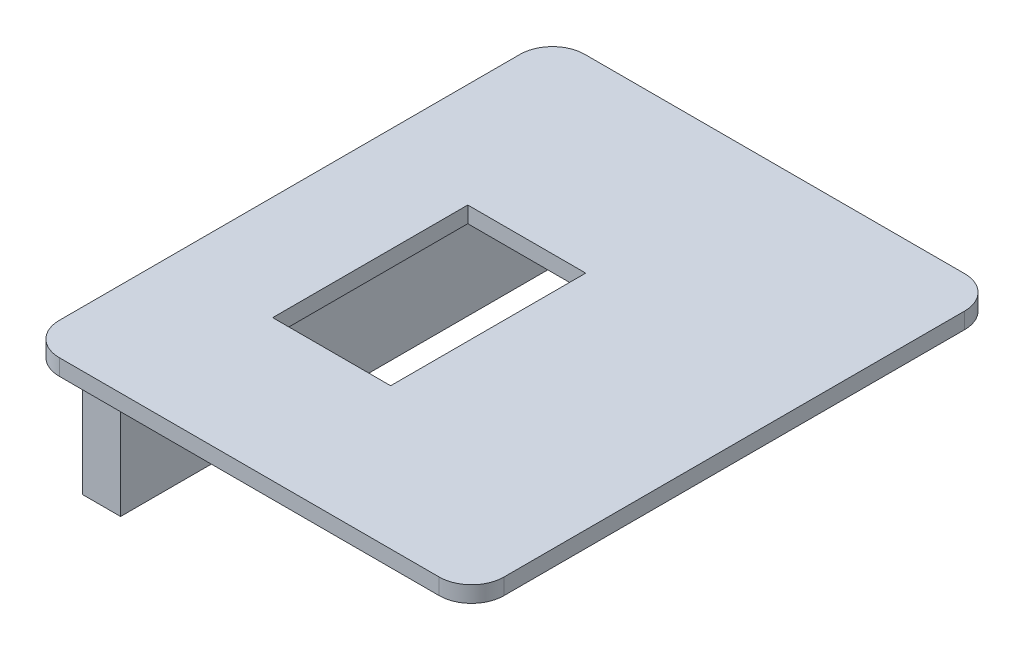
ISO-10303-21;
HEADER;
FILE_DESCRIPTION(('STEP AP214'),'2;1');
FILE_NAME('part.step','',(''),(''),'','','');
FILE_SCHEMA(('AUTOMOTIVE_DESIGN { 1 0 10303 214 1 1 1 1 }'));
ENDSEC;
DATA;
#1=APPLICATION_CONTEXT('core data for automotive mechanical design processes');
#2=APPLICATION_PROTOCOL_DEFINITION('international standard','automotive_design',2000,#1);
#3=PRODUCT_CONTEXT('',#1,'mechanical');
#4=PRODUCT('Part','Part','',(#3));
#5=PRODUCT_RELATED_PRODUCT_CATEGORY('part','',(#4));
#6=PRODUCT_DEFINITION_FORMATION('','',#4);
#7=PRODUCT_DEFINITION_CONTEXT('part definition',#1,'design');
#8=PRODUCT_DEFINITION('design','',#6,#7);
#9=PRODUCT_DEFINITION_SHAPE('','',#8);
#10=(LENGTH_UNIT() NAMED_UNIT(*) SI_UNIT(.MILLI.,.METRE.));
#11=(NAMED_UNIT(*) PLANE_ANGLE_UNIT() SI_UNIT($,.RADIAN.));
#12=(NAMED_UNIT(*) SI_UNIT($,.STERADIAN.) SOLID_ANGLE_UNIT());
#13=UNCERTAINTY_MEASURE_WITH_UNIT(LENGTH_MEASURE(1.E-05),#10,'distance_accuracy_value','');
#14=(GEOMETRIC_REPRESENTATION_CONTEXT(3) GLOBAL_UNCERTAINTY_ASSIGNED_CONTEXT((#13)) GLOBAL_UNIT_ASSIGNED_CONTEXT((#10,
#11,#12)) REPRESENTATION_CONTEXT('',''));
#15=CARTESIAN_POINT('',(0.,0.,0.));
#16=DIRECTION('',(0.,0.,1.));
#17=DIRECTION('',(1.,0.,0.));
#18=AXIS2_PLACEMENT_3D('',#15,#16,#17);
#19=CARTESIAN_POINT('',(23.5,0.,28.5));
#20=DIRECTION('',(0.,1.,0.));
#21=DIRECTION('',(0.,0.,1.));
#22=AXIS2_PLACEMENT_3D('',#19,#20,#21);
#23=PLANE('',#22);
#24=DIRECTION('',(0.,0.,-1.));
#25=VECTOR('',#24,1.);
#26=CARTESIAN_POINT('',(0.,0.,-9.11989795918369));
#27=LINE('',#26,#25);
#28=CARTESIAN_POINT('',(0.,0.,15.0127551020408));
#29=VERTEX_POINT('',#28);
#30=CARTESIAN_POINT('',(0.,0.,-9.11989795918369));
#31=VERTEX_POINT('',#30);
#32=EDGE_CURVE('E169',#29,#31,#27,.T.);
#33=ORIENTED_EDGE('',*,*,#32,.T.);
#34=DIRECTION('',(-1.,0.,0.));
#35=VECTOR('',#34,1.);
#36=CARTESIAN_POINT('',(-14.5918367346939,0.,-9.11989795918369));
#37=LINE('',#36,#35);
#38=CARTESIAN_POINT('',(-14.5918367346939,0.,-9.11989795918369));
#39=VERTEX_POINT('',#38);
#40=EDGE_CURVE('E172',#31,#39,#37,.T.);
#41=ORIENTED_EDGE('',*,*,#40,.T.);
#42=DIRECTION('',(0.,0.,1.));
#43=VECTOR('',#42,1.);
#44=CARTESIAN_POINT('',(-14.5918367346939,0.,-9.11989795918369));
#45=LINE('',#44,#43);
#46=CARTESIAN_POINT('',(-14.5918367346939,0.,15.0127551020408));
#47=VERTEX_POINT('',#46);
#48=EDGE_CURVE('E191',#39,#47,#45,.T.);
#49=ORIENTED_EDGE('',*,*,#48,.T.);
#50=DIRECTION('',(1.,0.,0.));
#51=VECTOR('',#50,1.);
#52=CARTESIAN_POINT('',(-14.5918367346939,0.,15.0127551020408));
#53=LINE('',#52,#51);
#54=EDGE_CURVE('E181',#47,#29,#53,.T.);
#55=ORIENTED_EDGE('',*,*,#54,.T.);
#56=EDGE_LOOP('',(#33,#41,#49,#55));
#57=FACE_BOUND('',#56,.T.);
#58=CARTESIAN_POINT('',(23.5,0.,28.5));
#59=DIRECTION('',(0.,1.,0.));
#60=DIRECTION('',(0.,0.,1.));
#61=AXIS2_PLACEMENT_3D('',#58,#59,#60);
#62=CIRCLE('',#61,4.);
#63=CARTESIAN_POINT('',(23.5,0.,32.5));
#64=VERTEX_POINT('',#63);
#65=CARTESIAN_POINT('',(27.5,0.,28.5));
#66=VERTEX_POINT('',#65);
#67=EDGE_CURVE('E205',#64,#66,#62,.T.);
#68=ORIENTED_EDGE('',*,*,#67,.F.);
#69=DIRECTION('',(1.,0.,0.));
#70=VECTOR('',#69,1.);
#71=CARTESIAN_POINT('',(-23.5,0.,32.5));
#72=LINE('',#71,#70);
#73=CARTESIAN_POINT('',(-23.5,0.,32.5));
#74=VERTEX_POINT('',#73);
#75=EDGE_CURVE('E210',#74,#64,#72,.T.);
#76=ORIENTED_EDGE('',*,*,#75,.F.);
#77=CARTESIAN_POINT('',(-23.5,0.,28.5));
#78=DIRECTION('',(0.,1.,0.));
#79=DIRECTION('',(0.,0.,-1.));
#80=AXIS2_PLACEMENT_3D('',#77,#78,#79);
#81=CIRCLE('',#80,4.);
#82=CARTESIAN_POINT('',(-27.5,0.,28.5));
#83=VERTEX_POINT('',#82);
#84=EDGE_CURVE('E237',#83,#74,#81,.T.);
#85=ORIENTED_EDGE('',*,*,#84,.F.);
#86=DIRECTION('',(0.,0.,1.));
#87=VECTOR('',#86,1.);
#88=CARTESIAN_POINT('',(-27.5,0.,28.5));
#89=LINE('',#88,#87);
#90=CARTESIAN_POINT('',(-27.5,0.,-28.5));
#91=VERTEX_POINT('',#90);
#92=EDGE_CURVE('E235',#91,#83,#89,.T.);
#93=ORIENTED_EDGE('',*,*,#92,.F.);
#94=CARTESIAN_POINT('',(-23.5,0.,-28.5));
#95=DIRECTION('',(0.,1.,0.));
#96=DIRECTION('',(0.,0.,-1.));
#97=AXIS2_PLACEMENT_3D('',#94,#95,#96);
#98=CIRCLE('',#97,4.);
#99=CARTESIAN_POINT('',(-23.5,0.,-32.5));
#100=VERTEX_POINT('',#99);
#101=EDGE_CURVE('E233',#100,#91,#98,.T.);
#102=ORIENTED_EDGE('',*,*,#101,.F.);
#103=DIRECTION('',(-1.,0.,0.));
#104=VECTOR('',#103,1.);
#105=CARTESIAN_POINT('',(-23.5,0.,-32.5));
#106=LINE('',#105,#104);
#107=CARTESIAN_POINT('',(23.5,0.,-32.5));
#108=VERTEX_POINT('',#107);
#109=EDGE_CURVE('E231',#108,#100,#106,.T.);
#110=ORIENTED_EDGE('',*,*,#109,.F.);
#111=CARTESIAN_POINT('',(23.5,0.,-28.5));
#112=DIRECTION('',(0.,1.,0.));
#113=DIRECTION('',(0.,0.,-1.));
#114=AXIS2_PLACEMENT_3D('',#111,#112,#113);
#115=CIRCLE('',#114,4.);
#116=CARTESIAN_POINT('',(27.5,0.,-28.5));
#117=VERTEX_POINT('',#116);
#118=EDGE_CURVE('E229',#117,#108,#115,.T.);
#119=ORIENTED_EDGE('',*,*,#118,.F.);
#120=DIRECTION('',(0.,0.,-1.));
#121=VECTOR('',#120,1.);
#122=CARTESIAN_POINT('',(27.5,0.,28.5));
#123=LINE('',#122,#121);
#124=EDGE_CURVE('E227',#66,#117,#123,.T.);
#125=ORIENTED_EDGE('',*,*,#124,.F.);
#126=EDGE_LOOP('',(#68,#76,#85,#93,#102,#110,#119,#125));
#127=FACE_BOUND('',#126,.T.);
#128=DIRECTION('',(0.,0.,1.));
#129=VECTOR('',#128,1.);
#130=CARTESIAN_POINT('',(-21.1919149970353,0.,27.2281366867646));
#131=LINE('',#130,#129);
#132=CARTESIAN_POINT('',(-21.1919149970353,0.,-27.2281366867647));
#133=VERTEX_POINT('',#132);
#134=CARTESIAN_POINT('',(-21.1919149970353,0.,27.2281366867646));
#135=VERTEX_POINT('',#134);
#136=EDGE_CURVE('E168',#133,#135,#131,.T.);
#137=ORIENTED_EDGE('',*,*,#136,.F.);
#138=DIRECTION('',(1.,0.,0.));
#139=VECTOR('',#138,1.);
#140=CARTESIAN_POINT('',(-25.8819289717891,0.,-27.2281366867647));
#141=LINE('',#140,#139);
#142=CARTESIAN_POINT('',(-25.8819289717891,0.,-27.2281366867647));
#143=VERTEX_POINT('',#142);
#144=EDGE_CURVE('E165',#143,#133,#141,.T.);
#145=ORIENTED_EDGE('',*,*,#144,.F.);
#146=DIRECTION('',(0.,0.,-1.));
#147=VECTOR('',#146,1.);
#148=CARTESIAN_POINT('',(-25.8819289717891,0.,27.2281366867646));
#149=LINE('',#148,#147);
#150=CARTESIAN_POINT('',(-25.8819289717891,0.,27.2281366867646));
#151=VERTEX_POINT('',#150);
#152=EDGE_CURVE('E55',#151,#143,#149,.T.);
#153=ORIENTED_EDGE('',*,*,#152,.F.);
#154=DIRECTION('',(-1.,0.,0.));
#155=VECTOR('',#154,1.);
#156=CARTESIAN_POINT('',(-25.8819289717891,0.,27.2281366867646));
#157=LINE('',#156,#155);
#158=EDGE_CURVE('E50',#135,#151,#157,.T.);
#159=ORIENTED_EDGE('',*,*,#158,.F.);
#160=EDGE_LOOP('',(#137,#145,#153,#159));
#161=FACE_BOUND('',#160,.T.);
#162=ADVANCED_FACE('F35',(#57,#127,#161),#23,.F.);
#163=CARTESIAN_POINT('',(23.5,2.,28.5));
#164=DIRECTION('',(0.,1.,0.));
#165=DIRECTION('',(0.,0.,1.));
#166=AXIS2_PLACEMENT_3D('',#163,#164,#165);
#167=PLANE('',#166);
#168=CARTESIAN_POINT('',(23.5,2.,28.5));
#169=DIRECTION('',(0.,1.,0.));
#170=DIRECTION('',(0.,0.,1.));
#171=AXIS2_PLACEMENT_3D('',#168,#169,#170);
#172=CIRCLE('',#171,4.);
#173=CARTESIAN_POINT('',(23.5,2.,32.5));
#174=VERTEX_POINT('',#173);
#175=CARTESIAN_POINT('',(27.5,2.,28.5));
#176=VERTEX_POINT('',#175);
#177=EDGE_CURVE('E206',#174,#176,#172,.T.);
#178=ORIENTED_EDGE('',*,*,#177,.T.);
#179=DIRECTION('',(0.,0.,-1.));
#180=VECTOR('',#179,1.);
#181=CARTESIAN_POINT('',(27.5,2.,28.5));
#182=LINE('',#181,#180);
#183=CARTESIAN_POINT('',(27.5,2.,-28.5));
#184=VERTEX_POINT('',#183);
#185=EDGE_CURVE('E209',#176,#184,#182,.T.);
#186=ORIENTED_EDGE('',*,*,#185,.T.);
#187=CARTESIAN_POINT('',(23.5,2.,-28.5));
#188=DIRECTION('',(0.,1.,0.));
#189=DIRECTION('',(0.,0.,-1.));
#190=AXIS2_PLACEMENT_3D('',#187,#188,#189);
#191=CIRCLE('',#190,4.);
#192=CARTESIAN_POINT('',(23.5,2.,-32.5));
#193=VERTEX_POINT('',#192);
#194=EDGE_CURVE('E212',#184,#193,#191,.T.);
#195=ORIENTED_EDGE('',*,*,#194,.T.);
#196=DIRECTION('',(-1.,0.,0.));
#197=VECTOR('',#196,1.);
#198=CARTESIAN_POINT('',(-23.5,2.,-32.5));
#199=LINE('',#198,#197);
#200=CARTESIAN_POINT('',(-23.5,2.,-32.5));
#201=VERTEX_POINT('',#200);
#202=EDGE_CURVE('E214',#193,#201,#199,.T.);
#203=ORIENTED_EDGE('',*,*,#202,.T.);
#204=CARTESIAN_POINT('',(-23.5,2.,-28.5));
#205=DIRECTION('',(0.,1.,0.));
#206=DIRECTION('',(0.,0.,-1.));
#207=AXIS2_PLACEMENT_3D('',#204,#205,#206);
#208=CIRCLE('',#207,4.);
#209=CARTESIAN_POINT('',(-27.5,2.,-28.5));
#210=VERTEX_POINT('',#209);
#211=EDGE_CURVE('E216',#201,#210,#208,.T.);
#212=ORIENTED_EDGE('',*,*,#211,.T.);
#213=DIRECTION('',(0.,0.,1.));
#214=VECTOR('',#213,1.);
#215=CARTESIAN_POINT('',(-27.5,2.,28.5));
#216=LINE('',#215,#214);
#217=CARTESIAN_POINT('',(-27.5,2.,28.5));
#218=VERTEX_POINT('',#217);
#219=EDGE_CURVE('E218',#210,#218,#216,.T.);
#220=ORIENTED_EDGE('',*,*,#219,.T.);
#221=CARTESIAN_POINT('',(-23.5,2.,28.5));
#222=DIRECTION('',(0.,1.,0.));
#223=DIRECTION('',(0.,0.,-1.));
#224=AXIS2_PLACEMENT_3D('',#221,#222,#223);
#225=CIRCLE('',#224,4.);
#226=CARTESIAN_POINT('',(-23.5,2.,32.5));
#227=VERTEX_POINT('',#226);
#228=EDGE_CURVE('E220',#218,#227,#225,.T.);
#229=ORIENTED_EDGE('',*,*,#228,.T.);
#230=DIRECTION('',(1.,0.,0.));
#231=VECTOR('',#230,1.);
#232=CARTESIAN_POINT('',(-23.5,2.,32.5));
#233=LINE('',#232,#231);
#234=EDGE_CURVE('E222',#227,#174,#233,.T.);
#235=ORIENTED_EDGE('',*,*,#234,.T.);
#236=EDGE_LOOP('',(#178,#186,#195,#203,#212,#220,#229,#235));
#237=FACE_BOUND('',#236,.T.);
#238=DIRECTION('',(-1.,0.,0.));
#239=VECTOR('',#238,1.);
#240=CARTESIAN_POINT('',(-14.5918367346939,2.,-9.11989795918369));
#241=LINE('',#240,#239);
#242=CARTESIAN_POINT('',(0.,2.,-9.11989795918369));
#243=VERTEX_POINT('',#242);
#244=CARTESIAN_POINT('',(-14.5918367346939,2.,-9.11989795918369));
#245=VERTEX_POINT('',#244);
#246=EDGE_CURVE('E180',#243,#245,#241,.T.);
#247=ORIENTED_EDGE('',*,*,#246,.F.);
#248=DIRECTION('',(0.,0.,-1.));
#249=VECTOR('',#248,1.);
#250=CARTESIAN_POINT('',(0.,2.,-9.11989795918369));
#251=LINE('',#250,#249);
#252=CARTESIAN_POINT('',(0.,2.,15.0127551020408));
#253=VERTEX_POINT('',#252);
#254=EDGE_CURVE('E178',#253,#243,#251,.T.);
#255=ORIENTED_EDGE('',*,*,#254,.F.);
#256=DIRECTION('',(1.,0.,0.));
#257=VECTOR('',#256,1.);
#258=CARTESIAN_POINT('',(-14.5918367346939,2.,15.0127551020408));
#259=LINE('',#258,#257);
#260=CARTESIAN_POINT('',(-14.5918367346939,2.,15.0127551020408));
#261=VERTEX_POINT('',#260);
#262=EDGE_CURVE('E186',#261,#253,#259,.T.);
#263=ORIENTED_EDGE('',*,*,#262,.F.);
#264=DIRECTION('',(0.,0.,1.));
#265=VECTOR('',#264,1.);
#266=CARTESIAN_POINT('',(-14.5918367346939,2.,-9.11989795918369));
#267=LINE('',#266,#265);
#268=EDGE_CURVE('E183',#245,#261,#267,.T.);
#269=ORIENTED_EDGE('',*,*,#268,.F.);
#270=EDGE_LOOP('',(#247,#255,#263,#269));
#271=FACE_BOUND('',#270,.T.);
#272=ADVANCED_FACE('F279',(#237,#271),#167,.T.);
#273=CARTESIAN_POINT('',(23.5,2.,28.5));
#274=DIRECTION('',(0.,-1.,0.));
#275=DIRECTION('',(0.,0.,-1.));
#276=AXIS2_PLACEMENT_3D('',#273,#274,#275);
#277=CYLINDRICAL_SURFACE('',#276,4.);
#278=ORIENTED_EDGE('',*,*,#67,.T.);
#279=DIRECTION('',(0.,-1.,0.));
#280=VECTOR('',#279,1.);
#281=CARTESIAN_POINT('',(27.5,2.,28.5));
#282=LINE('',#281,#280);
#283=EDGE_CURVE('E11',#176,#66,#282,.T.);
#284=ORIENTED_EDGE('',*,*,#283,.F.);
#285=ORIENTED_EDGE('',*,*,#177,.F.);
#286=DIRECTION('',(0.,-1.,0.));
#287=VECTOR('',#286,1.);
#288=CARTESIAN_POINT('',(23.5,2.,32.5));
#289=LINE('',#288,#287);
#290=EDGE_CURVE('E224',#174,#64,#289,.T.);
#291=ORIENTED_EDGE('',*,*,#290,.T.);
#292=EDGE_LOOP('',(#278,#284,#285,#291));
#293=FACE_BOUND('',#292,.T.);
#294=ADVANCED_FACE('F37',(#293),#277,.T.);
#295=CARTESIAN_POINT('',(27.5,2.,28.5));
#296=DIRECTION('',(-1.,0.,0.));
#297=DIRECTION('',(0.,0.,1.));
#298=AXIS2_PLACEMENT_3D('',#295,#296,#297);
#299=PLANE('',#298);
#300=ORIENTED_EDGE('',*,*,#124,.T.);
#301=DIRECTION('',(0.,-1.,0.));
#302=VECTOR('',#301,1.);
#303=CARTESIAN_POINT('',(27.5,2.,-28.5));
#304=LINE('',#303,#302);
#305=EDGE_CURVE('E43',#184,#117,#304,.T.);
#306=ORIENTED_EDGE('',*,*,#305,.F.);
#307=ORIENTED_EDGE('',*,*,#185,.F.);
#308=ORIENTED_EDGE('',*,*,#283,.T.);
#309=EDGE_LOOP('',(#300,#306,#307,#308));
#310=FACE_BOUND('',#309,.T.);
#311=ADVANCED_FACE('F284',(#310),#299,.F.);
#312=CARTESIAN_POINT('',(23.5,2.,-28.5));
#313=DIRECTION('',(0.,-1.,0.));
#314=DIRECTION('',(0.,0.,-1.));
#315=AXIS2_PLACEMENT_3D('',#312,#313,#314);
#316=CYLINDRICAL_SURFACE('',#315,4.);
#317=ORIENTED_EDGE('',*,*,#118,.T.);
#318=DIRECTION('',(0.,-1.,0.));
#319=VECTOR('',#318,1.);
#320=CARTESIAN_POINT('',(23.5,2.,-32.5));
#321=LINE('',#320,#319);
#322=EDGE_CURVE('E254',#193,#108,#321,.T.);
#323=ORIENTED_EDGE('',*,*,#322,.F.);
#324=ORIENTED_EDGE('',*,*,#194,.F.);
#325=ORIENTED_EDGE('',*,*,#305,.T.);
#326=EDGE_LOOP('',(#317,#323,#324,#325));
#327=FACE_BOUND('',#326,.T.);
#328=ADVANCED_FACE('F261',(#327),#316,.T.);
#329=CARTESIAN_POINT('',(-23.5,2.,-32.5));
#330=DIRECTION('',(0.,0.,1.));
#331=DIRECTION('',(1.,0.,0.));
#332=AXIS2_PLACEMENT_3D('',#329,#330,#331);
#333=PLANE('',#332);
#334=ORIENTED_EDGE('',*,*,#109,.T.);
#335=DIRECTION('',(0.,-1.,0.));
#336=VECTOR('',#335,1.);
#337=CARTESIAN_POINT('',(-23.5,2.,-32.5));
#338=LINE('',#337,#336);
#339=EDGE_CURVE('E251',#201,#100,#338,.T.);
#340=ORIENTED_EDGE('',*,*,#339,.F.);
#341=ORIENTED_EDGE('',*,*,#202,.F.);
#342=ORIENTED_EDGE('',*,*,#322,.T.);
#343=EDGE_LOOP('',(#334,#340,#341,#342));
#344=FACE_BOUND('',#343,.T.);
#345=ADVANCED_FACE('F271',(#344),#333,.F.);
#346=CARTESIAN_POINT('',(-23.5,2.,-28.5));
#347=DIRECTION('',(0.,-1.,0.));
#348=DIRECTION('',(0.,0.,-1.));
#349=AXIS2_PLACEMENT_3D('',#346,#347,#348);
#350=CYLINDRICAL_SURFACE('',#349,4.);
#351=ORIENTED_EDGE('',*,*,#101,.T.);
#352=DIRECTION('',(0.,-1.,0.));
#353=VECTOR('',#352,1.);
#354=CARTESIAN_POINT('',(-27.5,2.,-28.5));
#355=LINE('',#354,#353);
#356=EDGE_CURVE('E248',#210,#91,#355,.T.);
#357=ORIENTED_EDGE('',*,*,#356,.F.);
#358=ORIENTED_EDGE('',*,*,#211,.F.);
#359=ORIENTED_EDGE('',*,*,#339,.T.);
#360=EDGE_LOOP('',(#351,#357,#358,#359));
#361=FACE_BOUND('',#360,.T.);
#362=ADVANCED_FACE('F275',(#361),#350,.T.);
#363=CARTESIAN_POINT('',(-27.5,2.,28.5));
#364=DIRECTION('',(1.,0.,0.));
#365=DIRECTION('',(0.,0.,-1.));
#366=AXIS2_PLACEMENT_3D('',#363,#364,#365);
#367=PLANE('',#366);
#368=ORIENTED_EDGE('',*,*,#92,.T.);
#369=DIRECTION('',(0.,-1.,0.));
#370=VECTOR('',#369,1.);
#371=CARTESIAN_POINT('',(-27.5,2.,28.5));
#372=LINE('',#371,#370);
#373=EDGE_CURVE('E245',#218,#83,#372,.T.);
#374=ORIENTED_EDGE('',*,*,#373,.F.);
#375=ORIENTED_EDGE('',*,*,#219,.F.);
#376=ORIENTED_EDGE('',*,*,#356,.T.);
#377=EDGE_LOOP('',(#368,#374,#375,#376));
#378=FACE_BOUND('',#377,.T.);
#379=ADVANCED_FACE('F297',(#378),#367,.F.);
#380=CARTESIAN_POINT('',(-23.5,2.,28.5));
#381=DIRECTION('',(0.,-1.,0.));
#382=DIRECTION('',(0.,0.,-1.));
#383=AXIS2_PLACEMENT_3D('',#380,#381,#382);
#384=CYLINDRICAL_SURFACE('',#383,4.);
#385=ORIENTED_EDGE('',*,*,#84,.T.);
#386=DIRECTION('',(0.,-1.,0.));
#387=VECTOR('',#386,1.);
#388=CARTESIAN_POINT('',(-23.5,2.,32.5));
#389=LINE('',#388,#387);
#390=EDGE_CURVE('E242',#227,#74,#389,.T.);
#391=ORIENTED_EDGE('',*,*,#390,.F.);
#392=ORIENTED_EDGE('',*,*,#228,.F.);
#393=ORIENTED_EDGE('',*,*,#373,.T.);
#394=EDGE_LOOP('',(#385,#391,#392,#393));
#395=FACE_BOUND('',#394,.T.);
#396=ADVANCED_FACE('F295',(#395),#384,.T.);
#397=CARTESIAN_POINT('',(-23.5,2.,32.5));
#398=DIRECTION('',(0.,0.,-1.));
#399=DIRECTION('',(-1.,0.,0.));
#400=AXIS2_PLACEMENT_3D('',#397,#398,#399);
#401=PLANE('',#400);
#402=ORIENTED_EDGE('',*,*,#75,.T.);
#403=ORIENTED_EDGE('',*,*,#290,.F.);
#404=ORIENTED_EDGE('',*,*,#234,.F.);
#405=ORIENTED_EDGE('',*,*,#390,.T.);
#406=EDGE_LOOP('',(#402,#403,#404,#405));
#407=FACE_BOUND('',#406,.T.);
#408=ADVANCED_FACE('F290',(#407),#401,.F.);
#409=CARTESIAN_POINT('',(0.,2.,-9.11989795918369));
#410=DIRECTION('',(-1.,0.,0.));
#411=DIRECTION('',(0.,0.,1.));
#412=AXIS2_PLACEMENT_3D('',#409,#410,#411);
#413=PLANE('',#412);
#414=ORIENTED_EDGE('',*,*,#32,.F.);
#415=DIRECTION('',(0.,-1.,0.));
#416=VECTOR('',#415,1.);
#417=CARTESIAN_POINT('',(0.,2.,15.0127551020408));
#418=LINE('',#417,#416);
#419=EDGE_CURVE('E187',#253,#29,#418,.T.);
#420=ORIENTED_EDGE('',*,*,#419,.F.);
#421=ORIENTED_EDGE('',*,*,#254,.T.);
#422=DIRECTION('',(0.,-1.,0.));
#423=VECTOR('',#422,1.);
#424=CARTESIAN_POINT('',(0.,2.,-9.11989795918369));
#425=LINE('',#424,#423);
#426=EDGE_CURVE('E202',#243,#31,#425,.T.);
#427=ORIENTED_EDGE('',*,*,#426,.T.);
#428=EDGE_LOOP('',(#414,#420,#421,#427));
#429=FACE_BOUND('',#428,.T.);
#430=ADVANCED_FACE('F316',(#429),#413,.T.);
#431=CARTESIAN_POINT('',(-14.5918367346939,2.,-9.11989795918369));
#432=DIRECTION('',(0.,0.,1.));
#433=DIRECTION('',(1.,0.,0.));
#434=AXIS2_PLACEMENT_3D('',#431,#432,#433);
#435=PLANE('',#434);
#436=ORIENTED_EDGE('',*,*,#40,.F.);
#437=ORIENTED_EDGE('',*,*,#426,.F.);
#438=ORIENTED_EDGE('',*,*,#246,.T.);
#439=DIRECTION('',(0.,-1.,0.));
#440=VECTOR('',#439,1.);
#441=CARTESIAN_POINT('',(-14.5918367346939,2.,-9.11989795918369));
#442=LINE('',#441,#440);
#443=EDGE_CURVE('E200',#245,#39,#442,.T.);
#444=ORIENTED_EDGE('',*,*,#443,.T.);
#445=EDGE_LOOP('',(#436,#437,#438,#444));
#446=FACE_BOUND('',#445,.T.);
#447=ADVANCED_FACE('F320',(#446),#435,.T.);
#448=CARTESIAN_POINT('',(-14.5918367346939,2.,-9.11989795918369));
#449=DIRECTION('',(1.,0.,0.));
#450=DIRECTION('',(0.,0.,-1.));
#451=AXIS2_PLACEMENT_3D('',#448,#449,#450);
#452=PLANE('',#451);
#453=ORIENTED_EDGE('',*,*,#48,.F.);
#454=ORIENTED_EDGE('',*,*,#443,.F.);
#455=ORIENTED_EDGE('',*,*,#268,.T.);
#456=DIRECTION('',(0.,-1.,0.));
#457=VECTOR('',#456,1.);
#458=CARTESIAN_POINT('',(-14.5918367346939,2.,15.0127551020408));
#459=LINE('',#458,#457);
#460=EDGE_CURVE('E198',#261,#47,#459,.T.);
#461=ORIENTED_EDGE('',*,*,#460,.T.);
#462=EDGE_LOOP('',(#453,#454,#455,#461));
#463=FACE_BOUND('',#462,.T.);
#464=ADVANCED_FACE('F325',(#463),#452,.T.);
#465=CARTESIAN_POINT('',(-14.5918367346939,2.,15.0127551020408));
#466=DIRECTION('',(0.,0.,-1.));
#467=DIRECTION('',(-1.,0.,0.));
#468=AXIS2_PLACEMENT_3D('',#465,#466,#467);
#469=PLANE('',#468);
#470=ORIENTED_EDGE('',*,*,#54,.F.);
#471=ORIENTED_EDGE('',*,*,#460,.F.);
#472=ORIENTED_EDGE('',*,*,#262,.T.);
#473=ORIENTED_EDGE('',*,*,#419,.T.);
#474=EDGE_LOOP('',(#470,#471,#472,#473));
#475=FACE_BOUND('',#474,.T.);
#476=ADVANCED_FACE('F331',(#475),#469,.T.);
#477=CARTESIAN_POINT('',(-21.1919149970353,-16.5,27.2281366867646));
#478=DIRECTION('',(-1.,0.,0.));
#479=DIRECTION('',(0.,0.,1.));
#480=AXIS2_PLACEMENT_3D('',#477,#478,#479);
#481=PLANE('',#480);
#482=ORIENTED_EDGE('',*,*,#136,.T.);
#483=DIRECTION('',(0.,1.,0.));
#484=VECTOR('',#483,1.);
#485=CARTESIAN_POINT('',(-21.1919149970353,-16.5,27.2281366867646));
#486=LINE('',#485,#484);
#487=CARTESIAN_POINT('',(-21.1919149970353,-16.5,27.2281366867646));
#488=VERTEX_POINT('',#487);
#489=EDGE_CURVE('E149',#488,#135,#486,.T.);
#490=ORIENTED_EDGE('',*,*,#489,.F.);
#491=DIRECTION('',(0.,0.,1.));
#492=VECTOR('',#491,1.);
#493=CARTESIAN_POINT('',(-21.1919149970353,-16.5,27.2281366867646));
#494=LINE('',#493,#492);
#495=CARTESIAN_POINT('',(-21.1919149970353,-16.5,-27.2281366867647));
#496=VERTEX_POINT('',#495);
#497=EDGE_CURVE('E156',#496,#488,#494,.T.);
#498=ORIENTED_EDGE('',*,*,#497,.F.);
#499=DIRECTION('',(0.,1.,0.));
#500=VECTOR('',#499,1.);
#501=CARTESIAN_POINT('',(-21.1919149970353,-16.5,-27.2281366867647));
#502=LINE('',#501,#500);
#503=EDGE_CURVE('E463',#496,#133,#502,.T.);
#504=ORIENTED_EDGE('',*,*,#503,.T.);
#505=EDGE_LOOP('',(#482,#490,#498,#504));
#506=FACE_BOUND('',#505,.T.);
#507=ADVANCED_FACE('F167',(#506),#481,.F.);
#508=CARTESIAN_POINT('',(-25.8819289717891,-16.5,27.2281366867646));
#509=DIRECTION('',(0.,0.,-1.));
#510=DIRECTION('',(-1.,0.,0.));
#511=AXIS2_PLACEMENT_3D('',#508,#509,#510);
#512=PLANE('',#511);
#513=ORIENTED_EDGE('',*,*,#158,.T.);
#514=DIRECTION('',(0.,1.,0.));
#515=VECTOR('',#514,1.);
#516=CARTESIAN_POINT('',(-25.8819289717891,-16.5,27.2281366867646));
#517=LINE('',#516,#515);
#518=CARTESIAN_POINT('',(-25.8819289717891,-16.5,27.2281366867646));
#519=VERTEX_POINT('',#518);
#520=EDGE_CURVE('E152',#519,#151,#517,.T.);
#521=ORIENTED_EDGE('',*,*,#520,.F.);
#522=DIRECTION('',(-1.,0.,0.));
#523=VECTOR('',#522,1.);
#524=CARTESIAN_POINT('',(-25.8819289717891,-16.5,27.2281366867646));
#525=LINE('',#524,#523);
#526=EDGE_CURVE('E145',#488,#519,#525,.T.);
#527=ORIENTED_EDGE('',*,*,#526,.F.);
#528=ORIENTED_EDGE('',*,*,#489,.T.);
#529=EDGE_LOOP('',(#513,#521,#527,#528));
#530=FACE_BOUND('',#529,.T.);
#531=ADVANCED_FACE('F147',(#530),#512,.F.);
#532=CARTESIAN_POINT('',(-25.8819289717891,-16.5,27.2281366867646));
#533=DIRECTION('',(1.,0.,0.));
#534=DIRECTION('',(0.,0.,-1.));
#535=AXIS2_PLACEMENT_3D('',#532,#533,#534);
#536=PLANE('',#535);
#537=ORIENTED_EDGE('',*,*,#152,.T.);
#538=DIRECTION('',(0.,1.,0.));
#539=VECTOR('',#538,1.);
#540=CARTESIAN_POINT('',(-25.8819289717891,-16.5,-27.2281366867647));
#541=LINE('',#540,#539);
#542=CARTESIAN_POINT('',(-25.8819289717891,-16.5,-27.2281366867647));
#543=VERTEX_POINT('',#542);
#544=EDGE_CURVE('E174',#543,#143,#541,.T.);
#545=ORIENTED_EDGE('',*,*,#544,.F.);
#546=DIRECTION('',(0.,0.,-1.));
#547=VECTOR('',#546,1.);
#548=CARTESIAN_POINT('',(-25.8819289717891,-16.5,27.2281366867646));
#549=LINE('',#548,#547);
#550=EDGE_CURVE('E155',#519,#543,#549,.T.);
#551=ORIENTED_EDGE('',*,*,#550,.F.);
#552=ORIENTED_EDGE('',*,*,#520,.T.);
#553=EDGE_LOOP('',(#537,#545,#551,#552));
#554=FACE_BOUND('',#553,.T.);
#555=ADVANCED_FACE('F340',(#554),#536,.F.);
#556=CARTESIAN_POINT('',(-25.8819289717891,-16.5,-27.2281366867647));
#557=DIRECTION('',(0.,0.,1.));
#558=DIRECTION('',(1.,0.,0.));
#559=AXIS2_PLACEMENT_3D('',#556,#557,#558);
#560=PLANE('',#559);
#561=ORIENTED_EDGE('',*,*,#144,.T.);
#562=ORIENTED_EDGE('',*,*,#503,.F.);
#563=DIRECTION('',(1.,0.,0.));
#564=VECTOR('',#563,1.);
#565=CARTESIAN_POINT('',(-25.8819289717891,-16.5,-27.2281366867647));
#566=LINE('',#565,#564);
#567=EDGE_CURVE('E161',#543,#496,#566,.T.);
#568=ORIENTED_EDGE('',*,*,#567,.F.);
#569=ORIENTED_EDGE('',*,*,#544,.T.);
#570=EDGE_LOOP('',(#561,#562,#568,#569));
#571=FACE_BOUND('',#570,.T.);
#572=ADVANCED_FACE('F343',(#571),#560,.F.);
#573=CARTESIAN_POINT('',(0.,-16.5,0.));
#574=DIRECTION('',(0.,-1.,0.));
#575=DIRECTION('',(0.,0.,-1.));
#576=AXIS2_PLACEMENT_3D('',#573,#574,#575);
#577=PLANE('',#576);
#578=ORIENTED_EDGE('',*,*,#497,.T.);
#579=ORIENTED_EDGE('',*,*,#526,.T.);
#580=ORIENTED_EDGE('',*,*,#550,.T.);
#581=ORIENTED_EDGE('',*,*,#567,.T.);
#582=EDGE_LOOP('',(#578,#579,#580,#581));
#583=FACE_BOUND('',#582,.T.);
#584=ADVANCED_FACE('F159',(#583),#577,.T.);
#585=CLOSED_SHELL('',(#162,#272,#294,#311,#328,#345,#362,#379,#396,#408,#430,#447,#464,#476,
#507,#531,#555,#572,#584));
#586=MANIFOLD_SOLID_BREP('B2',#585);
#587=ADVANCED_BREP_SHAPE_REPRESENTATION('',(#18,#586),#14);
#588=SHAPE_DEFINITION_REPRESENTATION(#9,#587);
ENDSEC;
END-ISO-10303-21;
